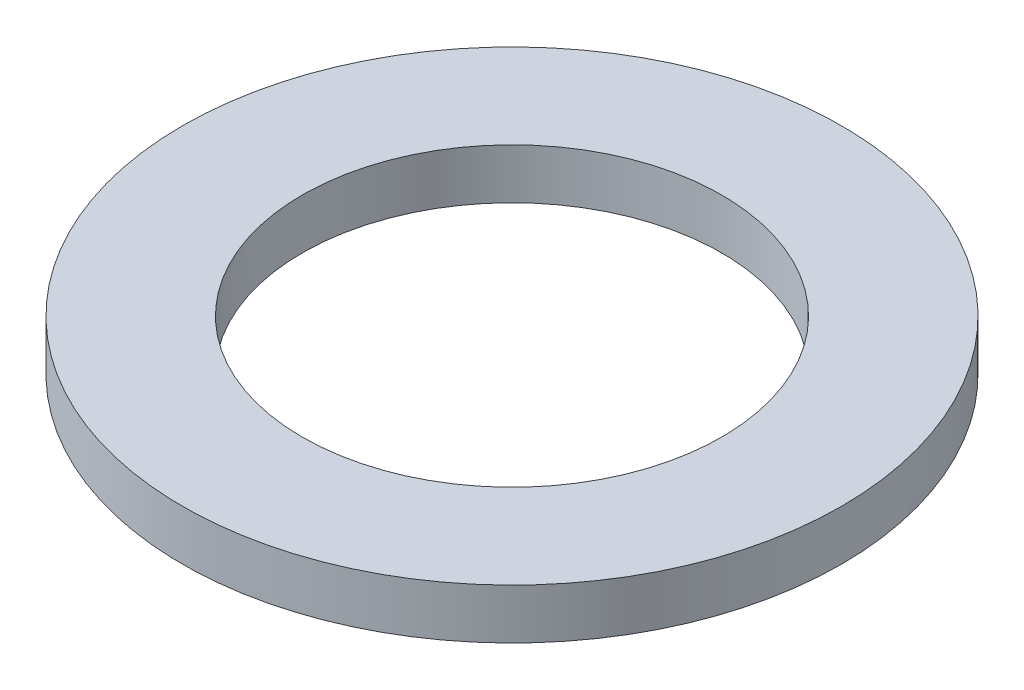
ISO-10303-21;
HEADER;
FILE_DESCRIPTION(('STEP AP214'),'2;1');
FILE_NAME('part.step','',(''),(''),'','','');
FILE_SCHEMA(('AUTOMOTIVE_DESIGN { 1 0 10303 214 1 1 1 1 }'));
ENDSEC;
DATA;
#1=APPLICATION_CONTEXT('core data for automotive mechanical design processes');
#2=APPLICATION_PROTOCOL_DEFINITION('international standard','automotive_design',2000,#1);
#3=PRODUCT_CONTEXT('',#1,'mechanical');
#4=PRODUCT('Part','Part','',(#3));
#5=PRODUCT_RELATED_PRODUCT_CATEGORY('part','',(#4));
#6=PRODUCT_DEFINITION_FORMATION('','',#4);
#7=PRODUCT_DEFINITION_CONTEXT('part definition',#1,'design');
#8=PRODUCT_DEFINITION('design','',#6,#7);
#9=PRODUCT_DEFINITION_SHAPE('','',#8);
#10=(LENGTH_UNIT() NAMED_UNIT(*) SI_UNIT(.MILLI.,.METRE.));
#11=(NAMED_UNIT(*) PLANE_ANGLE_UNIT() SI_UNIT($,.RADIAN.));
#12=(NAMED_UNIT(*) SI_UNIT($,.STERADIAN.) SOLID_ANGLE_UNIT());
#13=UNCERTAINTY_MEASURE_WITH_UNIT(LENGTH_MEASURE(1.E-05),#10,'distance_accuracy_value','');
#14=(GEOMETRIC_REPRESENTATION_CONTEXT(3) GLOBAL_UNCERTAINTY_ASSIGNED_CONTEXT((#13)) GLOBAL_UNIT_ASSIGNED_CONTEXT((#10,
#11,#12)) REPRESENTATION_CONTEXT('',''));
#15=CARTESIAN_POINT('',(0.,0.,0.));
#16=DIRECTION('',(0.,0.,1.));
#17=DIRECTION('',(1.,0.,0.));
#18=AXIS2_PLACEMENT_3D('',#15,#16,#17);
#19=CARTESIAN_POINT('',(0.,3.35,0.));
#20=DIRECTION('',(0.,1.,0.));
#21=DIRECTION('',(0.,0.,1.));
#22=AXIS2_PLACEMENT_3D('',#19,#20,#21);
#23=PLANE('',#22);
#24=CARTESIAN_POINT('',(0.,3.35,0.));
#25=DIRECTION('',(0.,1.,0.));
#26=DIRECTION('',(1.,0.,0.));
#27=AXIS2_PLACEMENT_3D('',#24,#25,#26);
#28=CIRCLE('',#27,22.);
#29=CARTESIAN_POINT('',(22.,3.35,0.));
#30=VERTEX_POINT('',#29);
#31=EDGE_CURVE('E11',#30,#30,#28,.T.);
#32=ORIENTED_EDGE('',*,*,#31,.T.);
#33=EDGE_LOOP('',(#32));
#34=FACE_BOUND('',#33,.T.);
#35=CARTESIAN_POINT('',(0.,3.35,0.));
#36=DIRECTION('',(0.,1.,0.));
#37=DIRECTION('',(0.,0.,1.));
#38=AXIS2_PLACEMENT_3D('',#35,#36,#37);
#39=CIRCLE('',#38,14.);
#40=CARTESIAN_POINT('',(0.,3.35,14.));
#41=VERTEX_POINT('',#40);
#42=EDGE_CURVE('E52',#41,#41,#39,.T.);
#43=ORIENTED_EDGE('',*,*,#42,.F.);
#44=EDGE_LOOP('',(#43));
#45=FACE_BOUND('',#44,.T.);
#46=ADVANCED_FACE('F41',(#34,#45),#23,.T.);
#47=CARTESIAN_POINT('',(0.,0.,0.));
#48=DIRECTION('',(0.,1.,0.));
#49=DIRECTION('',(0.,0.,1.));
#50=AXIS2_PLACEMENT_3D('',#47,#48,#49);
#51=PLANE('',#50);
#52=CARTESIAN_POINT('',(0.,0.,0.));
#53=DIRECTION('',(0.,1.,0.));
#54=DIRECTION('',(1.,0.,0.));
#55=AXIS2_PLACEMENT_3D('',#52,#53,#54);
#56=CIRCLE('',#55,22.);
#57=CARTESIAN_POINT('',(22.,0.,0.));
#58=VERTEX_POINT('',#57);
#59=EDGE_CURVE('E45',#58,#58,#56,.T.);
#60=ORIENTED_EDGE('',*,*,#59,.F.);
#61=EDGE_LOOP('',(#60));
#62=FACE_BOUND('',#61,.T.);
#63=CARTESIAN_POINT('',(0.,0.,0.));
#64=DIRECTION('',(0.,1.,0.));
#65=DIRECTION('',(0.,0.,1.));
#66=AXIS2_PLACEMENT_3D('',#63,#64,#65);
#67=CIRCLE('',#66,14.);
#68=CARTESIAN_POINT('',(0.,0.,14.));
#69=VERTEX_POINT('',#68);
#70=EDGE_CURVE('E54',#69,#69,#67,.T.);
#71=ORIENTED_EDGE('',*,*,#70,.T.);
#72=EDGE_LOOP('',(#71));
#73=FACE_BOUND('',#72,.T.);
#74=ADVANCED_FACE('F64',(#62,#73),#51,.F.);
#75=CARTESIAN_POINT('',(0.,3.35,0.));
#76=DIRECTION('',(0.,-1.,0.));
#77=DIRECTION('',(0.,0.,-1.));
#78=AXIS2_PLACEMENT_3D('',#75,#76,#77);
#79=CYLINDRICAL_SURFACE('',#78,22.);
#80=ORIENTED_EDGE('',*,*,#31,.F.);
#81=EDGE_LOOP('',(#80));
#82=FACE_BOUND('',#81,.T.);
#83=ORIENTED_EDGE('',*,*,#59,.T.);
#84=EDGE_LOOP('',(#83));
#85=FACE_BOUND('',#84,.T.);
#86=ADVANCED_FACE('F43',(#82,#85),#79,.T.);
#87=CARTESIAN_POINT('',(0.,3.35,0.));
#88=DIRECTION('',(0.,-1.,0.));
#89=DIRECTION('',(0.,0.,-1.));
#90=AXIS2_PLACEMENT_3D('',#87,#88,#89);
#91=CYLINDRICAL_SURFACE('',#90,14.);
#92=ORIENTED_EDGE('',*,*,#42,.T.);
#93=EDGE_LOOP('',(#92));
#94=FACE_BOUND('',#93,.T.);
#95=ORIENTED_EDGE('',*,*,#70,.F.);
#96=EDGE_LOOP('',(#95));
#97=FACE_BOUND('',#96,.T.);
#98=ADVANCED_FACE('F60',(#94,#97),#91,.F.);
#99=CLOSED_SHELL('',(#46,#74,#86,#98));
#100=MANIFOLD_SOLID_BREP('B2',#99);
#101=ADVANCED_BREP_SHAPE_REPRESENTATION('',(#18,#100),#14);
#102=SHAPE_DEFINITION_REPRESENTATION(#9,#101);
ENDSEC;
END-ISO-10303-21;
